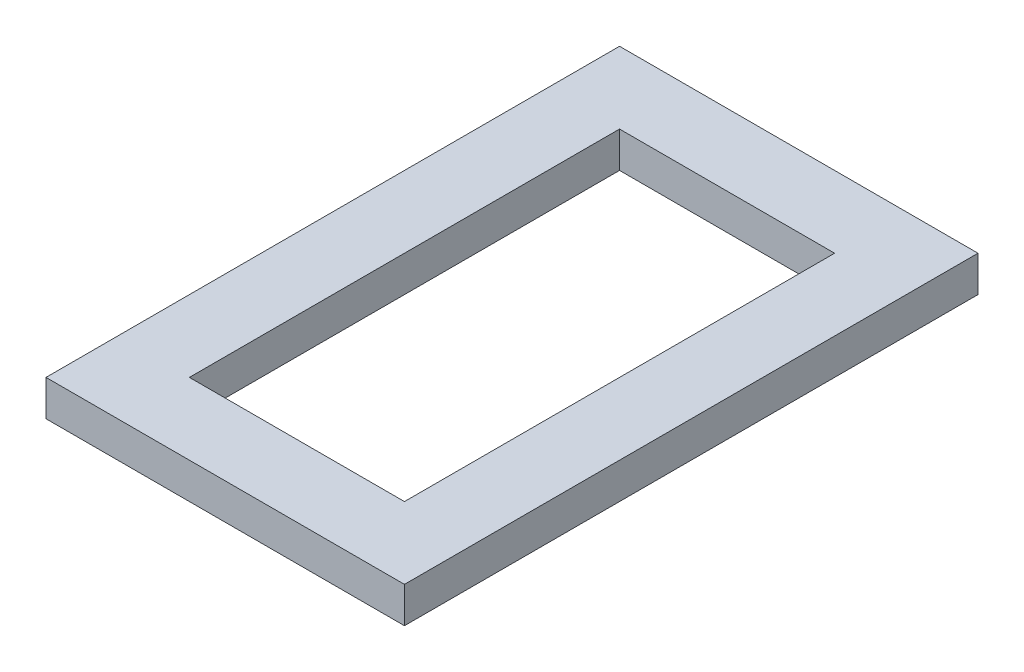
ISO-10303-21;
HEADER;
FILE_DESCRIPTION(('STEP AP214'),'2;1');
FILE_NAME('part.step','',(''),(''),'','','');
FILE_SCHEMA(('AUTOMOTIVE_DESIGN { 1 0 10303 214 1 1 1 1 }'));
ENDSEC;
DATA;
#1=APPLICATION_CONTEXT('core data for automotive mechanical design processes');
#2=APPLICATION_PROTOCOL_DEFINITION('international standard','automotive_design',2000,#1);
#3=PRODUCT_CONTEXT('',#1,'mechanical');
#4=PRODUCT('Part','Part','',(#3));
#5=PRODUCT_RELATED_PRODUCT_CATEGORY('part','',(#4));
#6=PRODUCT_DEFINITION_FORMATION('','',#4);
#7=PRODUCT_DEFINITION_CONTEXT('part definition',#1,'design');
#8=PRODUCT_DEFINITION('design','',#6,#7);
#9=PRODUCT_DEFINITION_SHAPE('','',#8);
#10=(LENGTH_UNIT() NAMED_UNIT(*) SI_UNIT(.MILLI.,.METRE.));
#11=(NAMED_UNIT(*) PLANE_ANGLE_UNIT() SI_UNIT($,.RADIAN.));
#12=(NAMED_UNIT(*) SI_UNIT($,.STERADIAN.) SOLID_ANGLE_UNIT());
#13=UNCERTAINTY_MEASURE_WITH_UNIT(LENGTH_MEASURE(1.E-05),#10,'distance_accuracy_value','');
#14=(GEOMETRIC_REPRESENTATION_CONTEXT(3) GLOBAL_UNCERTAINTY_ASSIGNED_CONTEXT((#13)) GLOBAL_UNIT_ASSIGNED_CONTEXT((#10,
#11,#12)) REPRESENTATION_CONTEXT('',''));
#15=CARTESIAN_POINT('',(0.,0.,0.));
#16=DIRECTION('',(0.,0.,1.));
#17=DIRECTION('',(1.,0.,0.));
#18=AXIS2_PLACEMENT_3D('',#15,#16,#17);
#19=CARTESIAN_POINT('',(0.,6.35,0.));
#20=DIRECTION('',(0.,0.,1.));
#21=DIRECTION('',(1.,0.,0.));
#22=AXIS2_PLACEMENT_3D('',#19,#20,#21);
#23=PLANE('',#22);
#24=DIRECTION('',(-1.,0.,0.));
#25=VECTOR('',#24,1.);
#26=CARTESIAN_POINT('',(0.,0.,0.));
#27=LINE('',#26,#25);
#28=CARTESIAN_POINT('',(0.,0.,0.));
#29=VERTEX_POINT('',#28);
#30=CARTESIAN_POINT('',(-63.5,0.,0.));
#31=VERTEX_POINT('',#30);
#32=EDGE_CURVE('E148',#29,#31,#27,.T.);
#33=ORIENTED_EDGE('',*,*,#32,.F.);
#34=DIRECTION('',(0.,-1.,0.));
#35=VECTOR('',#34,1.);
#36=CARTESIAN_POINT('',(0.,6.35,0.));
#37=LINE('',#36,#35);
#38=CARTESIAN_POINT('',(0.,6.35,0.));
#39=VERTEX_POINT('',#38);
#40=EDGE_CURVE('E11',#39,#29,#37,.T.);
#41=ORIENTED_EDGE('',*,*,#40,.F.);
#42=DIRECTION('',(-1.,0.,0.));
#43=VECTOR('',#42,1.);
#44=CARTESIAN_POINT('',(0.,6.35,0.));
#45=LINE('',#44,#43);
#46=CARTESIAN_POINT('',(-63.5,6.35,0.));
#47=VERTEX_POINT('',#46);
#48=EDGE_CURVE('E154',#39,#47,#45,.T.);
#49=ORIENTED_EDGE('',*,*,#48,.T.);
#50=DIRECTION('',(0.,-1.,0.));
#51=VECTOR('',#50,1.);
#52=CARTESIAN_POINT('',(-63.5,6.35,0.));
#53=LINE('',#52,#51);
#54=EDGE_CURVE('E42',#47,#31,#53,.T.);
#55=ORIENTED_EDGE('',*,*,#54,.T.);
#56=EDGE_LOOP('',(#33,#41,#49,#55));
#57=FACE_BOUND('',#56,.T.);
#58=ADVANCED_FACE('F39',(#57),#23,.T.);
#59=CARTESIAN_POINT('',(0.,6.35,0.));
#60=DIRECTION('',(-1.,0.,0.));
#61=DIRECTION('',(0.,0.,1.));
#62=AXIS2_PLACEMENT_3D('',#59,#60,#61);
#63=PLANE('',#62);
#64=DIRECTION('',(0.,0.,-1.));
#65=VECTOR('',#64,1.);
#66=CARTESIAN_POINT('',(0.,0.,0.));
#67=LINE('',#66,#65);
#68=CARTESIAN_POINT('',(0.,0.,-101.6));
#69=VERTEX_POINT('',#68);
#70=EDGE_CURVE('E159',#29,#69,#67,.T.);
#71=ORIENTED_EDGE('',*,*,#70,.T.);
#72=DIRECTION('',(0.,-1.,0.));
#73=VECTOR('',#72,1.);
#74=CARTESIAN_POINT('',(0.,6.35,-101.6));
#75=LINE('',#74,#73);
#76=CARTESIAN_POINT('',(0.,6.35,-101.6));
#77=VERTEX_POINT('',#76);
#78=EDGE_CURVE('E48',#77,#69,#75,.T.);
#79=ORIENTED_EDGE('',*,*,#78,.F.);
#80=DIRECTION('',(0.,0.,-1.));
#81=VECTOR('',#80,1.);
#82=CARTESIAN_POINT('',(0.,6.35,0.));
#83=LINE('',#82,#81);
#84=EDGE_CURVE('E166',#39,#77,#83,.T.);
#85=ORIENTED_EDGE('',*,*,#84,.F.);
#86=ORIENTED_EDGE('',*,*,#40,.T.);
#87=EDGE_LOOP('',(#71,#79,#85,#86));
#88=FACE_BOUND('',#87,.T.);
#89=ADVANCED_FACE('F199',(#88),#63,.F.);
#90=CARTESIAN_POINT('',(0.,6.35,-101.6));
#91=DIRECTION('',(0.,0.,1.));
#92=DIRECTION('',(1.,0.,0.));
#93=AXIS2_PLACEMENT_3D('',#90,#91,#92);
#94=PLANE('',#93);
#95=DIRECTION('',(-1.,0.,0.));
#96=VECTOR('',#95,1.);
#97=CARTESIAN_POINT('',(0.,0.,-101.6));
#98=LINE('',#97,#96);
#99=CARTESIAN_POINT('',(-63.5,0.,-101.6));
#100=VERTEX_POINT('',#99);
#101=EDGE_CURVE('E176',#69,#100,#98,.T.);
#102=ORIENTED_EDGE('',*,*,#101,.T.);
#103=DIRECTION('',(0.,-1.,0.));
#104=VECTOR('',#103,1.);
#105=CARTESIAN_POINT('',(-63.5,6.35,-101.6));
#106=LINE('',#105,#104);
#107=CARTESIAN_POINT('',(-63.5,6.35,-101.6));
#108=VERTEX_POINT('',#107);
#109=EDGE_CURVE('E184',#108,#100,#106,.T.);
#110=ORIENTED_EDGE('',*,*,#109,.F.);
#111=DIRECTION('',(-1.,0.,0.));
#112=VECTOR('',#111,1.);
#113=CARTESIAN_POINT('',(0.,6.35,-101.6));
#114=LINE('',#113,#112);
#115=EDGE_CURVE('E163',#77,#108,#114,.T.);
#116=ORIENTED_EDGE('',*,*,#115,.F.);
#117=ORIENTED_EDGE('',*,*,#78,.T.);
#118=EDGE_LOOP('',(#102,#110,#116,#117));
#119=FACE_BOUND('',#118,.T.);
#120=ADVANCED_FACE('F203',(#119),#94,.F.);
#121=CARTESIAN_POINT('',(-63.5,6.35,0.));
#122=DIRECTION('',(-1.,0.,0.));
#123=DIRECTION('',(0.,0.,1.));
#124=AXIS2_PLACEMENT_3D('',#121,#122,#123);
#125=PLANE('',#124);
#126=DIRECTION('',(0.,0.,-1.));
#127=VECTOR('',#126,1.);
#128=CARTESIAN_POINT('',(-63.5,0.,0.));
#129=LINE('',#128,#127);
#130=EDGE_CURVE('E172',#31,#100,#129,.T.);
#131=ORIENTED_EDGE('',*,*,#130,.F.);
#132=ORIENTED_EDGE('',*,*,#54,.F.);
#133=DIRECTION('',(0.,0.,-1.));
#134=VECTOR('',#133,1.);
#135=CARTESIAN_POINT('',(-63.5,6.35,0.));
#136=LINE('',#135,#134);
#137=EDGE_CURVE('E158',#47,#108,#136,.T.);
#138=ORIENTED_EDGE('',*,*,#137,.T.);
#139=ORIENTED_EDGE('',*,*,#109,.T.);
#140=EDGE_LOOP('',(#131,#132,#138,#139));
#141=FACE_BOUND('',#140,.T.);
#142=ADVANCED_FACE('F194',(#141),#125,.T.);
#143=CARTESIAN_POINT('',(0.,6.35,0.));
#144=DIRECTION('',(0.,-1.,0.));
#145=DIRECTION('',(0.,0.,-1.));
#146=AXIS2_PLACEMENT_3D('',#143,#144,#145);
#147=PLANE('',#146);
#148=DIRECTION('',(1.,0.,0.));
#149=VECTOR('',#148,1.);
#150=CARTESIAN_POINT('',(-50.8,6.35,-12.7));
#151=LINE('',#150,#149);
#152=CARTESIAN_POINT('',(-50.8,6.35,-12.7));
#153=VERTEX_POINT('',#152);
#154=CARTESIAN_POINT('',(-12.7,6.35,-12.7));
#155=VERTEX_POINT('',#154);
#156=EDGE_CURVE('E139',#153,#155,#151,.T.);
#157=ORIENTED_EDGE('',*,*,#156,.F.);
#158=DIRECTION('',(0.,0.,1.));
#159=VECTOR('',#158,1.);
#160=CARTESIAN_POINT('',(-50.8,6.35,-12.7));
#161=LINE('',#160,#159);
#162=CARTESIAN_POINT('',(-50.8,6.35,-88.9));
#163=VERTEX_POINT('',#162);
#164=EDGE_CURVE('E56',#163,#153,#161,.T.);
#165=ORIENTED_EDGE('',*,*,#164,.F.);
#166=DIRECTION('',(-1.,0.,0.));
#167=VECTOR('',#166,1.);
#168=CARTESIAN_POINT('',(-50.8,6.35,-88.9));
#169=LINE('',#168,#167);
#170=CARTESIAN_POINT('',(-12.7,6.35,-88.9));
#171=VERTEX_POINT('',#170);
#172=EDGE_CURVE('E126',#171,#163,#169,.T.);
#173=ORIENTED_EDGE('',*,*,#172,.F.);
#174=DIRECTION('',(0.,0.,-1.));
#175=VECTOR('',#174,1.);
#176=CARTESIAN_POINT('',(-12.7,6.35,-12.7));
#177=LINE('',#176,#175);
#178=EDGE_CURVE('E130',#155,#171,#177,.T.);
#179=ORIENTED_EDGE('',*,*,#178,.F.);
#180=EDGE_LOOP('',(#157,#165,#173,#179));
#181=FACE_BOUND('',#180,.T.);
#182=ORIENTED_EDGE('',*,*,#48,.F.);
#183=ORIENTED_EDGE('',*,*,#84,.T.);
#184=ORIENTED_EDGE('',*,*,#115,.T.);
#185=ORIENTED_EDGE('',*,*,#137,.F.);
#186=EDGE_LOOP('',(#182,#183,#184,#185));
#187=FACE_BOUND('',#186,.T.);
#188=ADVANCED_FACE('F205',(#181,#187),#147,.F.);
#189=CARTESIAN_POINT('',(0.,0.,0.));
#190=DIRECTION('',(0.,-1.,0.));
#191=DIRECTION('',(0.,0.,-1.));
#192=AXIS2_PLACEMENT_3D('',#189,#190,#191);
#193=PLANE('',#192);
#194=DIRECTION('',(0.,0.,1.));
#195=VECTOR('',#194,1.);
#196=CARTESIAN_POINT('',(-50.8,0.,-12.7));
#197=LINE('',#196,#195);
#198=CARTESIAN_POINT('',(-50.8,0.,-88.9));
#199=VERTEX_POINT('',#198);
#200=CARTESIAN_POINT('',(-50.8,0.,-12.7));
#201=VERTEX_POINT('',#200);
#202=EDGE_CURVE('E107',#199,#201,#197,.T.);
#203=ORIENTED_EDGE('',*,*,#202,.T.);
#204=DIRECTION('',(1.,0.,0.));
#205=VECTOR('',#204,1.);
#206=CARTESIAN_POINT('',(-50.8,0.,-12.7));
#207=LINE('',#206,#205);
#208=CARTESIAN_POINT('',(-12.7,0.,-12.7));
#209=VERTEX_POINT('',#208);
#210=EDGE_CURVE('E117',#201,#209,#207,.T.);
#211=ORIENTED_EDGE('',*,*,#210,.T.);
#212=DIRECTION('',(0.,0.,-1.));
#213=VECTOR('',#212,1.);
#214=CARTESIAN_POINT('',(-12.7,0.,-12.7));
#215=LINE('',#214,#213);
#216=CARTESIAN_POINT('',(-12.7,0.,-88.9));
#217=VERTEX_POINT('',#216);
#218=EDGE_CURVE('E64',#209,#217,#215,.T.);
#219=ORIENTED_EDGE('',*,*,#218,.T.);
#220=DIRECTION('',(-1.,0.,0.));
#221=VECTOR('',#220,1.);
#222=CARTESIAN_POINT('',(-50.8,0.,-88.9));
#223=LINE('',#222,#221);
#224=EDGE_CURVE('E114',#217,#199,#223,.T.);
#225=ORIENTED_EDGE('',*,*,#224,.T.);
#226=EDGE_LOOP('',(#203,#211,#219,#225));
#227=FACE_BOUND('',#226,.T.);
#228=ORIENTED_EDGE('',*,*,#32,.T.);
#229=ORIENTED_EDGE('',*,*,#130,.T.);
#230=ORIENTED_EDGE('',*,*,#101,.F.);
#231=ORIENTED_EDGE('',*,*,#70,.F.);
#232=EDGE_LOOP('',(#228,#229,#230,#231));
#233=FACE_BOUND('',#232,.T.);
#234=ADVANCED_FACE('F122',(#227,#233),#193,.T.);
#235=CARTESIAN_POINT('',(-50.8,0.,-12.7));
#236=DIRECTION('',(-1.,0.,0.));
#237=DIRECTION('',(0.,0.,1.));
#238=AXIS2_PLACEMENT_3D('',#235,#236,#237);
#239=PLANE('',#238);
#240=ORIENTED_EDGE('',*,*,#164,.T.);
#241=DIRECTION('',(0.,1.,0.));
#242=VECTOR('',#241,1.);
#243=CARTESIAN_POINT('',(-50.8,0.,-12.7));
#244=LINE('',#243,#242);
#245=EDGE_CURVE('E103',#201,#153,#244,.T.);
#246=ORIENTED_EDGE('',*,*,#245,.F.);
#247=ORIENTED_EDGE('',*,*,#202,.F.);
#248=DIRECTION('',(0.,1.,0.));
#249=VECTOR('',#248,1.);
#250=CARTESIAN_POINT('',(-50.8,0.,-88.9));
#251=LINE('',#250,#249);
#252=EDGE_CURVE('E145',#199,#163,#251,.T.);
#253=ORIENTED_EDGE('',*,*,#252,.T.);
#254=EDGE_LOOP('',(#240,#246,#247,#253));
#255=FACE_BOUND('',#254,.T.);
#256=ADVANCED_FACE('F105',(#255),#239,.F.);
#257=CARTESIAN_POINT('',(-50.8,0.,-88.9));
#258=DIRECTION('',(0.,0.,-1.));
#259=DIRECTION('',(-1.,0.,0.));
#260=AXIS2_PLACEMENT_3D('',#257,#258,#259);
#261=PLANE('',#260);
#262=ORIENTED_EDGE('',*,*,#172,.T.);
#263=ORIENTED_EDGE('',*,*,#252,.F.);
#264=ORIENTED_EDGE('',*,*,#224,.F.);
#265=DIRECTION('',(0.,1.,0.));
#266=VECTOR('',#265,1.);
#267=CARTESIAN_POINT('',(-12.7,0.,-88.9));
#268=LINE('',#267,#266);
#269=EDGE_CURVE('E149',#217,#171,#268,.T.);
#270=ORIENTED_EDGE('',*,*,#269,.T.);
#271=EDGE_LOOP('',(#262,#263,#264,#270));
#272=FACE_BOUND('',#271,.T.);
#273=ADVANCED_FACE('F249',(#272),#261,.F.);
#274=CARTESIAN_POINT('',(-12.7,0.,-12.7));
#275=DIRECTION('',(1.,0.,0.));
#276=DIRECTION('',(0.,0.,-1.));
#277=AXIS2_PLACEMENT_3D('',#274,#275,#276);
#278=PLANE('',#277);
#279=ORIENTED_EDGE('',*,*,#178,.T.);
#280=ORIENTED_EDGE('',*,*,#269,.F.);
#281=ORIENTED_EDGE('',*,*,#218,.F.);
#282=DIRECTION('',(0.,1.,0.));
#283=VECTOR('',#282,1.);
#284=CARTESIAN_POINT('',(-12.7,0.,-12.7));
#285=LINE('',#284,#283);
#286=EDGE_CURVE('E113',#209,#155,#285,.T.);
#287=ORIENTED_EDGE('',*,*,#286,.T.);
#288=EDGE_LOOP('',(#279,#280,#281,#287));
#289=FACE_BOUND('',#288,.T.);
#290=ADVANCED_FACE('F257',(#289),#278,.F.);
#291=CARTESIAN_POINT('',(-50.8,0.,-12.7));
#292=DIRECTION('',(0.,0.,1.));
#293=DIRECTION('',(1.,0.,0.));
#294=AXIS2_PLACEMENT_3D('',#291,#292,#293);
#295=PLANE('',#294);
#296=ORIENTED_EDGE('',*,*,#156,.T.);
#297=ORIENTED_EDGE('',*,*,#286,.F.);
#298=ORIENTED_EDGE('',*,*,#210,.F.);
#299=ORIENTED_EDGE('',*,*,#245,.T.);
#300=EDGE_LOOP('',(#296,#297,#298,#299));
#301=FACE_BOUND('',#300,.T.);
#302=ADVANCED_FACE('F118',(#301),#295,.F.);
#303=CLOSED_SHELL('',(#58,#89,#120,#142,#188,#234,#256,#273,#290,#302));
#304=MANIFOLD_SOLID_BREP('B2',#303);
#305=ADVANCED_BREP_SHAPE_REPRESENTATION('',(#18,#304),#14);
#306=SHAPE_DEFINITION_REPRESENTATION(#9,#305);
ENDSEC;
END-ISO-10303-21;
